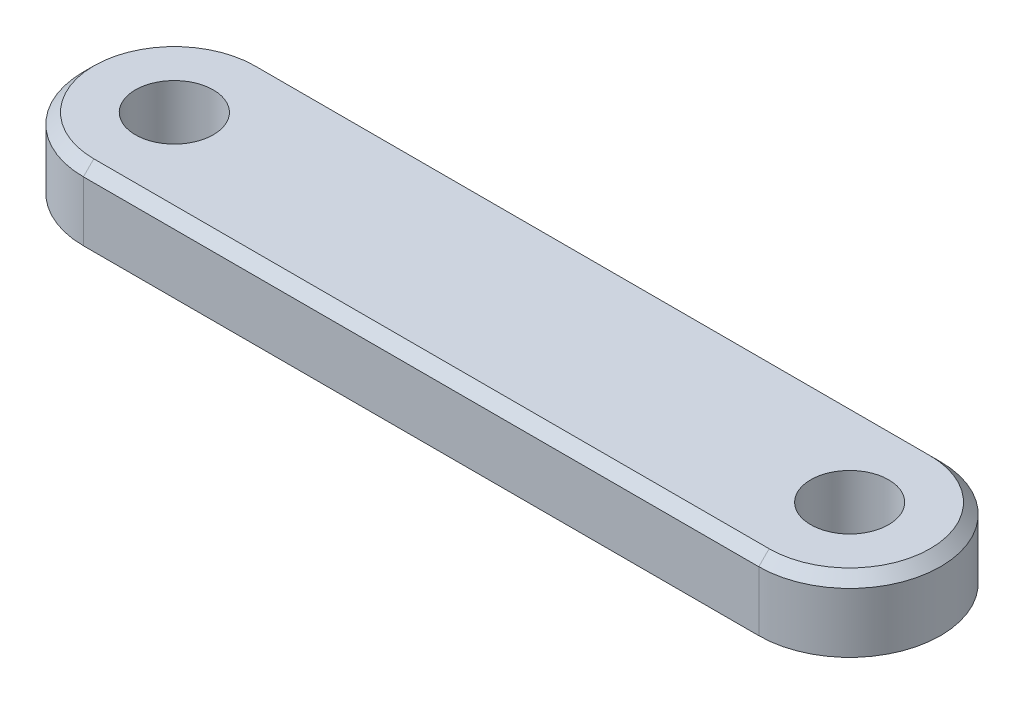
ISO-10303-21;
HEADER;
FILE_DESCRIPTION(('STEP AP214'),'2;1');
FILE_NAME('part.step','',(''),(''),'','','');
FILE_SCHEMA(('AUTOMOTIVE_DESIGN { 1 0 10303 214 1 1 1 1 }'));
ENDSEC;
DATA;
#1=APPLICATION_CONTEXT('core data for automotive mechanical design processes');
#2=APPLICATION_PROTOCOL_DEFINITION('international standard','automotive_design',2000,#1);
#3=PRODUCT_CONTEXT('',#1,'mechanical');
#4=PRODUCT('Part','Part','',(#3));
#5=PRODUCT_RELATED_PRODUCT_CATEGORY('part','',(#4));
#6=PRODUCT_DEFINITION_FORMATION('','',#4);
#7=PRODUCT_DEFINITION_CONTEXT('part definition',#1,'design');
#8=PRODUCT_DEFINITION('design','',#6,#7);
#9=PRODUCT_DEFINITION_SHAPE('','',#8);
#10=(LENGTH_UNIT() NAMED_UNIT(*) SI_UNIT(.MILLI.,.METRE.));
#11=(NAMED_UNIT(*) PLANE_ANGLE_UNIT() SI_UNIT($,.RADIAN.));
#12=(NAMED_UNIT(*) SI_UNIT($,.STERADIAN.) SOLID_ANGLE_UNIT());
#13=UNCERTAINTY_MEASURE_WITH_UNIT(LENGTH_MEASURE(1.E-05),#10,'distance_accuracy_value','');
#14=(GEOMETRIC_REPRESENTATION_CONTEXT(3) GLOBAL_UNCERTAINTY_ASSIGNED_CONTEXT((#13)) GLOBAL_UNIT_ASSIGNED_CONTEXT((#10,
#11,#12)) REPRESENTATION_CONTEXT('',''));
#15=CARTESIAN_POINT('',(0.,0.,0.));
#16=DIRECTION('',(0.,0.,1.));
#17=DIRECTION('',(1.,0.,0.));
#18=AXIS2_PLACEMENT_3D('',#15,#16,#17);
#19=CARTESIAN_POINT('',(-13.,1.35,0.));
#20=DIRECTION('',(0.,1.,0.));
#21=DIRECTION('',(0.,0.,1.));
#22=AXIS2_PLACEMENT_3D('',#19,#20,#21);
#23=PLANE('',#22);
#24=DIRECTION('',(1.,0.,0.));
#25=VECTOR('',#24,1.);
#26=CARTESIAN_POINT('',(13.,1.35,3.1));
#27=LINE('',#26,#25);
#28=CARTESIAN_POINT('',(-13.,1.35,3.1));
#29=VERTEX_POINT('',#28);
#30=CARTESIAN_POINT('',(13.,1.35,3.1));
#31=VERTEX_POINT('',#30);
#32=EDGE_CURVE('E105',#29,#31,#27,.T.);
#33=ORIENTED_EDGE('',*,*,#32,.T.);
#34=CARTESIAN_POINT('',(13.,1.35,0.));
#35=DIRECTION('',(0.,1.,0.));
#36=DIRECTION('',(0.,0.,1.));
#37=AXIS2_PLACEMENT_3D('',#34,#35,#36);
#38=CIRCLE('',#37,3.1);
#39=CARTESIAN_POINT('',(13.,1.35,-3.1));
#40=VERTEX_POINT('',#39);
#41=EDGE_CURVE('E150',#31,#40,#38,.T.);
#42=ORIENTED_EDGE('',*,*,#41,.T.);
#43=DIRECTION('',(-1.,0.,0.));
#44=VECTOR('',#43,1.);
#45=CARTESIAN_POINT('',(-13.,1.35,-3.1));
#46=LINE('',#45,#44);
#47=CARTESIAN_POINT('',(-13.,1.35,-3.1));
#48=VERTEX_POINT('',#47);
#49=EDGE_CURVE('E147',#40,#48,#46,.T.);
#50=ORIENTED_EDGE('',*,*,#49,.T.);
#51=CARTESIAN_POINT('',(-13.,1.35,0.));
#52=DIRECTION('',(0.,1.,0.));
#53=DIRECTION('',(0.,0.,1.));
#54=AXIS2_PLACEMENT_3D('',#51,#52,#53);
#55=CIRCLE('',#54,3.1);
#56=EDGE_CURVE('E144',#48,#29,#55,.T.);
#57=ORIENTED_EDGE('',*,*,#56,.T.);
#58=EDGE_LOOP('',(#33,#42,#50,#57));
#59=FACE_BOUND('',#58,.T.);
#60=CARTESIAN_POINT('',(-13.,1.35,0.));
#61=DIRECTION('',(0.,1.,0.));
#62=DIRECTION('',(0.,0.,1.));
#63=AXIS2_PLACEMENT_3D('',#60,#61,#62);
#64=CIRCLE('',#63,1.5);
#65=CARTESIAN_POINT('',(-13.,1.35,-1.5));
#66=VERTEX_POINT('',#65);
#67=EDGE_CURVE('E122',#66,#66,#64,.T.);
#68=ORIENTED_EDGE('',*,*,#67,.F.);
#69=EDGE_LOOP('',(#68));
#70=FACE_BOUND('',#69,.T.);
#71=CARTESIAN_POINT('',(13.,1.35,0.));
#72=DIRECTION('',(0.,1.,0.));
#73=DIRECTION('',(0.,0.,-1.));
#74=AXIS2_PLACEMENT_3D('',#71,#72,#73);
#75=CIRCLE('',#74,1.5);
#76=CARTESIAN_POINT('',(13.,1.35,-1.50000000000001));
#77=VERTEX_POINT('',#76);
#78=EDGE_CURVE('E183',#77,#77,#75,.T.);
#79=ORIENTED_EDGE('',*,*,#78,.F.);
#80=EDGE_LOOP('',(#79));
#81=FACE_BOUND('',#80,.T.);
#82=ADVANCED_FACE('F45',(#59,#70,#81),#23,.T.);
#83=CARTESIAN_POINT('',(-13.,-1.35,0.));
#84=DIRECTION('',(0.,1.,0.));
#85=DIRECTION('',(0.,0.,1.));
#86=AXIS2_PLACEMENT_3D('',#83,#84,#85);
#87=PLANE('',#86);
#88=CARTESIAN_POINT('',(-13.,-1.35,0.));
#89=DIRECTION('',(0.,1.,0.));
#90=DIRECTION('',(0.,0.,1.));
#91=AXIS2_PLACEMENT_3D('',#88,#89,#90);
#92=CIRCLE('',#91,3.5);
#93=CARTESIAN_POINT('',(-13.,-1.35,-3.5));
#94=VERTEX_POINT('',#93);
#95=CARTESIAN_POINT('',(-13.,-1.35,3.5));
#96=VERTEX_POINT('',#95);
#97=EDGE_CURVE('E113',#94,#96,#92,.T.);
#98=ORIENTED_EDGE('',*,*,#97,.F.);
#99=DIRECTION('',(-1.,0.,0.));
#100=VECTOR('',#99,1.);
#101=CARTESIAN_POINT('',(-13.,-1.35,-3.5));
#102=LINE('',#101,#100);
#103=CARTESIAN_POINT('',(13.,-1.35,-3.5));
#104=VERTEX_POINT('',#103);
#105=EDGE_CURVE('E132',#104,#94,#102,.T.);
#106=ORIENTED_EDGE('',*,*,#105,.F.);
#107=CARTESIAN_POINT('',(13.,-1.35,0.));
#108=DIRECTION('',(0.,1.,0.));
#109=DIRECTION('',(0.,0.,1.));
#110=AXIS2_PLACEMENT_3D('',#107,#108,#109);
#111=CIRCLE('',#110,3.5);
#112=CARTESIAN_POINT('',(13.,-1.35,3.5));
#113=VERTEX_POINT('',#112);
#114=EDGE_CURVE('E115',#113,#104,#111,.T.);
#115=ORIENTED_EDGE('',*,*,#114,.F.);
#116=DIRECTION('',(1.,0.,0.));
#117=VECTOR('',#116,1.);
#118=CARTESIAN_POINT('',(-13.,-1.35,3.5));
#119=LINE('',#118,#117);
#120=EDGE_CURVE('E101',#96,#113,#119,.T.);
#121=ORIENTED_EDGE('',*,*,#120,.F.);
#122=EDGE_LOOP('',(#98,#106,#115,#121));
#123=FACE_BOUND('',#122,.T.);
#124=CARTESIAN_POINT('',(-13.,-1.35,0.));
#125=DIRECTION('',(0.,1.,0.));
#126=DIRECTION('',(0.,0.,1.));
#127=AXIS2_PLACEMENT_3D('',#124,#125,#126);
#128=CIRCLE('',#127,1.5);
#129=CARTESIAN_POINT('',(-13.,-1.35,-1.5));
#130=VERTEX_POINT('',#129);
#131=EDGE_CURVE('E126',#130,#130,#128,.T.);
#132=ORIENTED_EDGE('',*,*,#131,.T.);
#133=EDGE_LOOP('',(#132));
#134=FACE_BOUND('',#133,.T.);
#135=CARTESIAN_POINT('',(13.,-1.35,0.));
#136=DIRECTION('',(0.,1.,0.));
#137=DIRECTION('',(0.,0.,-1.));
#138=AXIS2_PLACEMENT_3D('',#135,#136,#137);
#139=CIRCLE('',#138,1.5);
#140=CARTESIAN_POINT('',(13.,-1.35,-1.50000000000001));
#141=VERTEX_POINT('',#140);
#142=EDGE_CURVE('E177',#141,#141,#139,.T.);
#143=ORIENTED_EDGE('',*,*,#142,.T.);
#144=EDGE_LOOP('',(#143));
#145=FACE_BOUND('',#144,.T.);
#146=ADVANCED_FACE('F110',(#123,#134,#145),#87,.F.);
#147=CARTESIAN_POINT('',(-13.,1.35,0.));
#148=DIRECTION('',(0.,-1.,0.));
#149=DIRECTION('',(0.,0.,-1.));
#150=AXIS2_PLACEMENT_3D('',#147,#148,#149);
#151=CYLINDRICAL_SURFACE('',#150,3.5);
#152=DIRECTION('',(0.,-1.,0.));
#153=VECTOR('',#152,1.);
#154=CARTESIAN_POINT('',(-13.,1.35,3.5));
#155=LINE('',#154,#153);
#156=CARTESIAN_POINT('',(-13.,0.949999999999999,3.5));
#157=VERTEX_POINT('',#156);
#158=EDGE_CURVE('E98',#157,#96,#155,.T.);
#159=ORIENTED_EDGE('',*,*,#158,.F.);
#160=CARTESIAN_POINT('',(-13.,0.949999999999999,0.));
#161=DIRECTION('',(0.,1.,0.));
#162=DIRECTION('',(0.,0.,1.));
#163=AXIS2_PLACEMENT_3D('',#160,#161,#162);
#164=CIRCLE('',#163,3.5);
#165=CARTESIAN_POINT('',(-13.,0.949999999999999,-3.5));
#166=VERTEX_POINT('',#165);
#167=EDGE_CURVE('E56',#157,#166,#164,.F.);
#168=ORIENTED_EDGE('',*,*,#167,.T.);
#169=DIRECTION('',(0.,-1.,0.));
#170=VECTOR('',#169,1.);
#171=CARTESIAN_POINT('',(-13.,1.35,-3.5));
#172=LINE('',#171,#170);
#173=EDGE_CURVE('E119',#166,#94,#172,.T.);
#174=ORIENTED_EDGE('',*,*,#173,.T.);
#175=ORIENTED_EDGE('',*,*,#97,.T.);
#176=EDGE_LOOP('',(#159,#168,#174,#175));
#177=FACE_BOUND('',#176,.T.);
#178=ADVANCED_FACE('F118',(#177),#151,.T.);
#179=CARTESIAN_POINT('',(-13.,1.35,3.5));
#180=DIRECTION('',(0.,0.,-1.));
#181=DIRECTION('',(-1.,0.,0.));
#182=AXIS2_PLACEMENT_3D('',#179,#180,#181);
#183=PLANE('',#182);
#184=DIRECTION('',(0.,-1.,0.));
#185=VECTOR('',#184,1.);
#186=CARTESIAN_POINT('',(13.,1.35,3.5));
#187=LINE('',#186,#185);
#188=CARTESIAN_POINT('',(13.,0.949999999999999,3.5));
#189=VERTEX_POINT('',#188);
#190=EDGE_CURVE('E106',#189,#113,#187,.T.);
#191=ORIENTED_EDGE('',*,*,#190,.F.);
#192=DIRECTION('',(-1.,0.,0.));
#193=VECTOR('',#192,1.);
#194=CARTESIAN_POINT('',(-13.,0.949999999999999,3.5));
#195=LINE('',#194,#193);
#196=EDGE_CURVE('E11',#189,#157,#195,.T.);
#197=ORIENTED_EDGE('',*,*,#196,.T.);
#198=ORIENTED_EDGE('',*,*,#158,.T.);
#199=ORIENTED_EDGE('',*,*,#120,.T.);
#200=EDGE_LOOP('',(#191,#197,#198,#199));
#201=FACE_BOUND('',#200,.T.);
#202=ADVANCED_FACE('F100',(#201),#183,.F.);
#203=CARTESIAN_POINT('',(13.,1.35,0.));
#204=DIRECTION('',(0.,-1.,0.));
#205=DIRECTION('',(0.,0.,-1.));
#206=AXIS2_PLACEMENT_3D('',#203,#204,#205);
#207=CYLINDRICAL_SURFACE('',#206,3.5);
#208=DIRECTION('',(0.,-1.,0.));
#209=VECTOR('',#208,1.);
#210=CARTESIAN_POINT('',(13.,1.35,-3.5));
#211=LINE('',#210,#209);
#212=CARTESIAN_POINT('',(13.,0.949999999999999,-3.5));
#213=VERTEX_POINT('',#212);
#214=EDGE_CURVE('E137',#213,#104,#211,.T.);
#215=ORIENTED_EDGE('',*,*,#214,.F.);
#216=CARTESIAN_POINT('',(13.,0.949999999999999,0.));
#217=DIRECTION('',(0.,1.,0.));
#218=DIRECTION('',(0.,0.,1.));
#219=AXIS2_PLACEMENT_3D('',#216,#217,#218);
#220=CIRCLE('',#219,3.5);
#221=EDGE_CURVE('E154',#213,#189,#220,.F.);
#222=ORIENTED_EDGE('',*,*,#221,.T.);
#223=ORIENTED_EDGE('',*,*,#190,.T.);
#224=ORIENTED_EDGE('',*,*,#114,.T.);
#225=EDGE_LOOP('',(#215,#222,#223,#224));
#226=FACE_BOUND('',#225,.T.);
#227=ADVANCED_FACE('F207',(#226),#207,.T.);
#228=CARTESIAN_POINT('',(-13.,1.35,-3.5));
#229=DIRECTION('',(0.,0.,1.));
#230=DIRECTION('',(1.,0.,0.));
#231=AXIS2_PLACEMENT_3D('',#228,#229,#230);
#232=PLANE('',#231);
#233=ORIENTED_EDGE('',*,*,#173,.F.);
#234=DIRECTION('',(1.,0.,0.));
#235=VECTOR('',#234,1.);
#236=CARTESIAN_POINT('',(13.,0.949999999999999,-3.5));
#237=LINE('',#236,#235);
#238=EDGE_CURVE('E158',#166,#213,#237,.T.);
#239=ORIENTED_EDGE('',*,*,#238,.T.);
#240=ORIENTED_EDGE('',*,*,#214,.T.);
#241=ORIENTED_EDGE('',*,*,#105,.T.);
#242=EDGE_LOOP('',(#233,#239,#240,#241));
#243=FACE_BOUND('',#242,.T.);
#244=ADVANCED_FACE('F199',(#243),#232,.F.);
#245=CARTESIAN_POINT('',(-13.,1.35,0.));
#246=DIRECTION('',(0.,-1.,0.));
#247=DIRECTION('',(0.,0.,-1.));
#248=AXIS2_PLACEMENT_3D('',#245,#246,#247);
#249=CYLINDRICAL_SURFACE('',#248,1.5);
#250=CARTESIAN_POINT('',(-13.,1.35,-1.5));
#251=CARTESIAN_POINT('',(-13.,1.321875,-1.5));
#252=CARTESIAN_POINT('',(-13.,1.29375,-1.5));
#253=CARTESIAN_POINT('',(-13.,1.2375,-1.5));
#254=CARTESIAN_POINT('',(-13.,1.209375,-1.5));
#255=CARTESIAN_POINT('',(-13.,1.153125,-1.5));
#256=CARTESIAN_POINT('',(-13.,1.125,-1.5));
#257=CARTESIAN_POINT('',(-13.,1.06875,-1.5));
#258=CARTESIAN_POINT('',(-13.,1.040625,-1.5));
#259=CARTESIAN_POINT('',(-13.,0.984375,-1.5));
#260=CARTESIAN_POINT('',(-13.,0.95625,-1.5));
#261=CARTESIAN_POINT('',(-13.,0.9,-1.5));
#262=CARTESIAN_POINT('',(-13.,0.871875,-1.5));
#263=CARTESIAN_POINT('',(-13.,0.815625,-1.5));
#264=CARTESIAN_POINT('',(-13.,0.7875,-1.5));
#265=CARTESIAN_POINT('',(-13.,0.73125,-1.5));
#266=CARTESIAN_POINT('',(-13.,0.703125,-1.5));
#267=CARTESIAN_POINT('',(-13.,0.646875,-1.5));
#268=CARTESIAN_POINT('',(-13.,0.61875,-1.5));
#269=CARTESIAN_POINT('',(-13.,0.5625,-1.5));
#270=CARTESIAN_POINT('',(-13.,0.534375,-1.5));
#271=CARTESIAN_POINT('',(-13.,0.478125,-1.5));
#272=CARTESIAN_POINT('',(-13.,0.45,-1.5));
#273=CARTESIAN_POINT('',(-13.,0.39375,-1.5));
#274=CARTESIAN_POINT('',(-13.,0.365625,-1.5));
#275=CARTESIAN_POINT('',(-13.,0.309375,-1.5));
#276=CARTESIAN_POINT('',(-13.,0.28125,-1.5));
#277=CARTESIAN_POINT('',(-13.,0.225,-1.5));
#278=CARTESIAN_POINT('',(-13.,0.196875,-1.5));
#279=CARTESIAN_POINT('',(-13.,0.140625,-1.5));
#280=CARTESIAN_POINT('',(-13.,0.1125,-1.5));
#281=CARTESIAN_POINT('',(-13.,0.0562499999999996,-1.5));
#282=CARTESIAN_POINT('',(-13.,0.0281249999999996,-1.5));
#283=CARTESIAN_POINT('',(-13.,-0.0281250000000004,-1.5));
#284=CARTESIAN_POINT('',(-13.,-0.0562500000000005,-1.5));
#285=CARTESIAN_POINT('',(-13.,-0.1125,-1.5));
#286=CARTESIAN_POINT('',(-13.,-0.140625,-1.5));
#287=CARTESIAN_POINT('',(-13.,-0.196875000000001,-1.5));
#288=CARTESIAN_POINT('',(-13.,-0.225000000000001,-1.5));
#289=CARTESIAN_POINT('',(-13.,-0.28125,-1.5));
#290=CARTESIAN_POINT('',(-13.,-0.309375000000001,-1.5));
#291=CARTESIAN_POINT('',(-13.,-0.365625000000001,-1.5));
#292=CARTESIAN_POINT('',(-13.,-0.393750000000001,-1.5));
#293=CARTESIAN_POINT('',(-13.,-0.450000000000001,-1.5));
#294=CARTESIAN_POINT('',(-13.,-0.478125000000001,-1.5));
#295=CARTESIAN_POINT('',(-13.,-0.534375000000001,-1.5));
#296=CARTESIAN_POINT('',(-13.,-0.562500000000001,-1.5));
#297=CARTESIAN_POINT('',(-13.,-0.61875,-1.5));
#298=CARTESIAN_POINT('',(-13.,-0.646875,-1.5));
#299=CARTESIAN_POINT('',(-13.,-0.703125,-1.5));
#300=CARTESIAN_POINT('',(-13.,-0.73125,-1.5));
#301=CARTESIAN_POINT('',(-13.,-0.7875,-1.5));
#302=CARTESIAN_POINT('',(-13.,-0.815625,-1.5));
#303=CARTESIAN_POINT('',(-13.,-0.871875,-1.5));
#304=CARTESIAN_POINT('',(-13.,-0.9,-1.5));
#305=CARTESIAN_POINT('',(-13.,-0.95625,-1.5));
#306=CARTESIAN_POINT('',(-13.,-0.984375,-1.5));
#307=CARTESIAN_POINT('',(-13.,-1.040625,-1.5));
#308=CARTESIAN_POINT('',(-13.,-1.06875,-1.5));
#309=CARTESIAN_POINT('',(-13.,-1.125,-1.5));
#310=CARTESIAN_POINT('',(-13.,-1.153125,-1.5));
#311=CARTESIAN_POINT('',(-13.,-1.209375,-1.5));
#312=CARTESIAN_POINT('',(-13.,-1.2375,-1.5));
#313=CARTESIAN_POINT('',(-13.,-1.29375,-1.5));
#314=CARTESIAN_POINT('',(-13.,-1.321875,-1.5));
#315=CARTESIAN_POINT('',(-13.,-1.35,-1.5));
#316=B_SPLINE_CURVE_WITH_KNOTS('',3,(#250,#251,#252,#253,#254,#255,#256,#257,#258,#259,#260,
#261,#262,#263,#264,#265,#266,#267,#268,#269,#270,#271,#272,#273,#274,#275,#276,#277,#278,#279,
#280,#281,#282,#283,#284,#285,#286,#287,#288,#289,#290,#291,#292,#293,#294,#295,#296,#297,#298,
#299,#300,#301,#302,#303,#304,#305,#306,#307,#308,#309,#310,#311,#312,#313,#314,#315),
.UNSPECIFIED.,.F.,.F.,(4,2,2,2,2,2,2,2,2,2,2,2,2,2,2,2,2,2,2,2,2,2,2,2,2,2,2,2,2,2,2,2,4),(0.,
0.0843749999999998,0.16875,0.253125,0.3375,0.421875,0.50625,0.590625,0.675,0.759375,0.84375,
0.928125,1.0125,1.096875,1.18125,1.265625,1.35,1.434375,1.51875,1.603125,1.6875,1.771875,
1.85625,1.940625,2.025,2.109375,2.19375,2.278125,2.3625,2.446875,2.53125,2.615625,2.7),.UNSPECIFIED.);
#317=EDGE_CURVE('BSEAM196',#66,#130,#316,.T.);
#318=ORIENTED_EDGE('',*,*,#67,.T.);
#319=ORIENTED_EDGE('',*,*,#131,.F.);
#320=ORIENTED_EDGE('',*,*,#317,.T.);
#321=ORIENTED_EDGE('',*,*,#317,.F.);
#322=EDGE_LOOP('',(#318,#320,#319,#321));
#323=FACE_BOUND('',#322,.T.);
#324=ADVANCED_FACE('F196',(#323),#249,.F.);
#325=CARTESIAN_POINT('',(13.,1.35,0.));
#326=DIRECTION('',(0.,-1.,0.));
#327=DIRECTION('',(0.,0.,-1.));
#328=AXIS2_PLACEMENT_3D('',#325,#326,#327);
#329=CYLINDRICAL_SURFACE('',#328,1.5);
#330=CARTESIAN_POINT('',(13.,1.35,-1.50000000000001));
#331=CARTESIAN_POINT('',(13.,1.321875,-1.50000000000001));
#332=CARTESIAN_POINT('',(13.,1.29375,-1.50000000000001));
#333=CARTESIAN_POINT('',(13.,1.2375,-1.50000000000001));
#334=CARTESIAN_POINT('',(13.,1.209375,-1.50000000000001));
#335=CARTESIAN_POINT('',(13.,1.153125,-1.50000000000001));
#336=CARTESIAN_POINT('',(13.,1.125,-1.50000000000001));
#337=CARTESIAN_POINT('',(13.,1.06875,-1.50000000000001));
#338=CARTESIAN_POINT('',(13.,1.040625,-1.50000000000001));
#339=CARTESIAN_POINT('',(13.,0.984375,-1.50000000000001));
#340=CARTESIAN_POINT('',(13.,0.95625,-1.50000000000001));
#341=CARTESIAN_POINT('',(13.,0.9,-1.50000000000001));
#342=CARTESIAN_POINT('',(13.,0.871875,-1.50000000000001));
#343=CARTESIAN_POINT('',(13.,0.815625,-1.50000000000001));
#344=CARTESIAN_POINT('',(13.,0.7875,-1.50000000000001));
#345=CARTESIAN_POINT('',(13.,0.73125,-1.50000000000001));
#346=CARTESIAN_POINT('',(13.,0.703125,-1.50000000000001));
#347=CARTESIAN_POINT('',(13.,0.646875,-1.50000000000001));
#348=CARTESIAN_POINT('',(13.,0.61875,-1.50000000000001));
#349=CARTESIAN_POINT('',(13.,0.5625,-1.50000000000001));
#350=CARTESIAN_POINT('',(13.,0.534375,-1.50000000000001));
#351=CARTESIAN_POINT('',(13.,0.478125,-1.50000000000001));
#352=CARTESIAN_POINT('',(13.,0.45,-1.50000000000001));
#353=CARTESIAN_POINT('',(13.,0.39375,-1.50000000000001));
#354=CARTESIAN_POINT('',(13.,0.365625,-1.50000000000001));
#355=CARTESIAN_POINT('',(13.,0.309375,-1.50000000000001));
#356=CARTESIAN_POINT('',(13.,0.28125,-1.50000000000001));
#357=CARTESIAN_POINT('',(13.,0.225,-1.50000000000001));
#358=CARTESIAN_POINT('',(13.,0.196875,-1.50000000000001));
#359=CARTESIAN_POINT('',(13.,0.140625,-1.50000000000001));
#360=CARTESIAN_POINT('',(13.,0.1125,-1.50000000000001));
#361=CARTESIAN_POINT('',(13.,0.0562499999999996,-1.50000000000001));
#362=CARTESIAN_POINT('',(13.,0.0281249999999996,-1.50000000000001));
#363=CARTESIAN_POINT('',(13.,-0.0281250000000004,-1.50000000000001));
#364=CARTESIAN_POINT('',(13.,-0.0562500000000005,-1.50000000000001));
#365=CARTESIAN_POINT('',(13.,-0.1125,-1.50000000000001));
#366=CARTESIAN_POINT('',(13.,-0.140625,-1.50000000000001));
#367=CARTESIAN_POINT('',(13.,-0.196875000000001,-1.50000000000001));
#368=CARTESIAN_POINT('',(13.,-0.225000000000001,-1.50000000000001));
#369=CARTESIAN_POINT('',(13.,-0.28125,-1.50000000000001));
#370=CARTESIAN_POINT('',(13.,-0.309375000000001,-1.50000000000001));
#371=CARTESIAN_POINT('',(13.,-0.365625000000001,-1.50000000000001));
#372=CARTESIAN_POINT('',(13.,-0.393750000000001,-1.50000000000001));
#373=CARTESIAN_POINT('',(13.,-0.450000000000001,-1.50000000000001));
#374=CARTESIAN_POINT('',(13.,-0.478125000000001,-1.50000000000001));
#375=CARTESIAN_POINT('',(13.,-0.534375000000001,-1.50000000000001));
#376=CARTESIAN_POINT('',(13.,-0.562500000000001,-1.50000000000001));
#377=CARTESIAN_POINT('',(13.,-0.61875,-1.50000000000001));
#378=CARTESIAN_POINT('',(13.,-0.646875,-1.50000000000001));
#379=CARTESIAN_POINT('',(13.,-0.703125,-1.50000000000001));
#380=CARTESIAN_POINT('',(13.,-0.73125,-1.50000000000001));
#381=CARTESIAN_POINT('',(13.,-0.7875,-1.50000000000001));
#382=CARTESIAN_POINT('',(13.,-0.815625,-1.50000000000001));
#383=CARTESIAN_POINT('',(13.,-0.871875,-1.50000000000001));
#384=CARTESIAN_POINT('',(13.,-0.9,-1.50000000000001));
#385=CARTESIAN_POINT('',(13.,-0.95625,-1.50000000000001));
#386=CARTESIAN_POINT('',(13.,-0.984375,-1.50000000000001));
#387=CARTESIAN_POINT('',(13.,-1.040625,-1.50000000000001));
#388=CARTESIAN_POINT('',(13.,-1.06875,-1.50000000000001));
#389=CARTESIAN_POINT('',(13.,-1.125,-1.50000000000001));
#390=CARTESIAN_POINT('',(13.,-1.153125,-1.50000000000001));
#391=CARTESIAN_POINT('',(13.,-1.209375,-1.50000000000001));
#392=CARTESIAN_POINT('',(13.,-1.2375,-1.50000000000001));
#393=CARTESIAN_POINT('',(13.,-1.29375,-1.50000000000001));
#394=CARTESIAN_POINT('',(13.,-1.321875,-1.50000000000001));
#395=CARTESIAN_POINT('',(13.,-1.35,-1.50000000000001));
#396=B_SPLINE_CURVE_WITH_KNOTS('',3,(#330,#331,#332,#333,#334,#335,#336,#337,#338,#339,#340,
#341,#342,#343,#344,#345,#346,#347,#348,#349,#350,#351,#352,#353,#354,#355,#356,#357,#358,#359,
#360,#361,#362,#363,#364,#365,#366,#367,#368,#369,#370,#371,#372,#373,#374,#375,#376,#377,#378,
#379,#380,#381,#382,#383,#384,#385,#386,#387,#388,#389,#390,#391,#392,#393,#394,#395),
.UNSPECIFIED.,.F.,.F.,(4,2,2,2,2,2,2,2,2,2,2,2,2,2,2,2,2,2,2,2,2,2,2,2,2,2,2,2,2,2,2,2,4),(0.,
0.0843749999999998,0.16875,0.253125,0.3375,0.421875,0.50625,0.590625,0.675,0.759375,0.84375,
0.928125,1.0125,1.096875,1.18125,1.265625,1.35,1.434375,1.51875,1.603125,1.6875,1.771875,
1.85625,1.940625,2.025,2.109375,2.19375,2.278125,2.3625,2.446875,2.53125,2.615625,2.7),.UNSPECIFIED.);
#397=EDGE_CURVE('BSEAM198',#77,#141,#396,.T.);
#398=ORIENTED_EDGE('',*,*,#78,.T.);
#399=ORIENTED_EDGE('',*,*,#142,.F.);
#400=ORIENTED_EDGE('',*,*,#397,.T.);
#401=ORIENTED_EDGE('',*,*,#397,.F.);
#402=EDGE_LOOP('',(#398,#400,#399,#401));
#403=FACE_BOUND('',#402,.T.);
#404=ADVANCED_FACE('F198',(#403),#329,.F.);
#405=CARTESIAN_POINT('',(-13.,1.35,0.));
#406=DIRECTION('',(0.,-1.,0.));
#407=DIRECTION('',(0.,0.,-1.));
#408=AXIS2_PLACEMENT_3D('',#405,#406,#407);
#409=CONICAL_SURFACE('',#408,3.1,0.785398163397448);
#410=DIRECTION('',(0.,0.707106781186547,0.707106781186547));
#411=VECTOR('',#410,1.);
#412=CARTESIAN_POINT('',(-13.,0.949999999999999,-3.5));
#413=LINE('',#412,#411);
#414=EDGE_CURVE('E168',#166,#48,#413,.T.);
#415=ORIENTED_EDGE('',*,*,#414,.F.);
#416=ORIENTED_EDGE('',*,*,#167,.F.);
#417=DIRECTION('',(0.,-0.707106781186547,0.707106781186547));
#418=VECTOR('',#417,1.);
#419=CARTESIAN_POINT('',(-13.,1.35,3.1));
#420=LINE('',#419,#418);
#421=EDGE_CURVE('E50',#29,#157,#420,.T.);
#422=ORIENTED_EDGE('',*,*,#421,.F.);
#423=ORIENTED_EDGE('',*,*,#56,.F.);
#424=EDGE_LOOP('',(#415,#416,#422,#423));
#425=FACE_BOUND('',#424,.T.);
#426=ADVANCED_FACE('F48',(#425),#409,.T.);
#427=CARTESIAN_POINT('',(-13.,1.35,3.1));
#428=DIRECTION('',(0.,0.707106781186547,0.707106781186547));
#429=DIRECTION('',(-1.,0.,0.));
#430=AXIS2_PLACEMENT_3D('',#427,#428,#429);
#431=PLANE('',#430);
#432=ORIENTED_EDGE('',*,*,#421,.T.);
#433=ORIENTED_EDGE('',*,*,#196,.F.);
#434=DIRECTION('',(0.,-0.707106781186547,0.707106781186547));
#435=VECTOR('',#434,1.);
#436=CARTESIAN_POINT('',(13.,1.35,3.1));
#437=LINE('',#436,#435);
#438=EDGE_CURVE('E166',#31,#189,#437,.T.);
#439=ORIENTED_EDGE('',*,*,#438,.F.);
#440=ORIENTED_EDGE('',*,*,#32,.F.);
#441=EDGE_LOOP('',(#432,#433,#439,#440));
#442=FACE_BOUND('',#441,.T.);
#443=ADVANCED_FACE('F239',(#442),#431,.T.);
#444=CARTESIAN_POINT('',(-13.,1.35,-3.1));
#445=DIRECTION('',(0.,0.707106781186547,-0.707106781186547));
#446=DIRECTION('',(1.,0.,0.));
#447=AXIS2_PLACEMENT_3D('',#444,#445,#446);
#448=PLANE('',#447);
#449=ORIENTED_EDGE('',*,*,#414,.T.);
#450=ORIENTED_EDGE('',*,*,#49,.F.);
#451=DIRECTION('',(0.,0.707106781186547,0.707106781186547));
#452=VECTOR('',#451,1.);
#453=CARTESIAN_POINT('',(13.,0.949999999999999,-3.5));
#454=LINE('',#453,#452);
#455=EDGE_CURVE('E163',#213,#40,#454,.T.);
#456=ORIENTED_EDGE('',*,*,#455,.F.);
#457=ORIENTED_EDGE('',*,*,#238,.F.);
#458=EDGE_LOOP('',(#449,#450,#456,#457));
#459=FACE_BOUND('',#458,.T.);
#460=ADVANCED_FACE('F233',(#459),#448,.T.);
#461=CARTESIAN_POINT('',(13.,1.35,0.));
#462=DIRECTION('',(0.,-1.,0.));
#463=DIRECTION('',(0.,0.,-1.));
#464=AXIS2_PLACEMENT_3D('',#461,#462,#463);
#465=CONICAL_SURFACE('',#464,3.1,0.785398163397448);
#466=ORIENTED_EDGE('',*,*,#438,.T.);
#467=ORIENTED_EDGE('',*,*,#221,.F.);
#468=ORIENTED_EDGE('',*,*,#455,.T.);
#469=ORIENTED_EDGE('',*,*,#41,.F.);
#470=EDGE_LOOP('',(#466,#467,#468,#469));
#471=FACE_BOUND('',#470,.T.);
#472=ADVANCED_FACE('F227',(#471),#465,.T.);
#473=CLOSED_SHELL('',(#82,#146,#178,#202,#227,#244,#324,#404,#426,#443,#460,#472));
#474=MANIFOLD_SOLID_BREP('B2',#473);
#475=ADVANCED_BREP_SHAPE_REPRESENTATION('',(#18,#474),#14);
#476=SHAPE_DEFINITION_REPRESENTATION(#9,#475);
ENDSEC;
END-ISO-10303-21;
